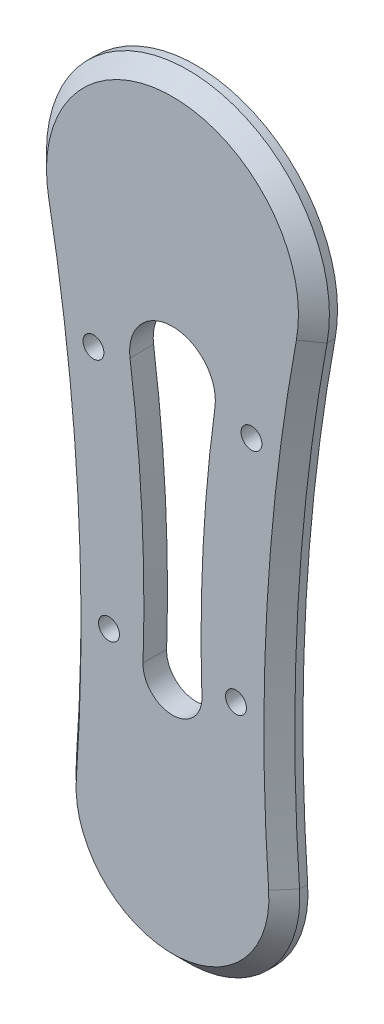
ISO-10303-21;
HEADER;
FILE_DESCRIPTION(('STEP AP214'),'2;1');
FILE_NAME('part.step','',(''),(''),'','','');
FILE_SCHEMA(('AUTOMOTIVE_DESIGN { 1 0 10303 214 1 1 1 1 }'));
ENDSEC;
DATA;
#1=APPLICATION_CONTEXT('core data for automotive mechanical design processes');
#2=APPLICATION_PROTOCOL_DEFINITION('international standard','automotive_design',2000,#1);
#3=PRODUCT_CONTEXT('',#1,'mechanical');
#4=PRODUCT('Part','Part','',(#3));
#5=PRODUCT_RELATED_PRODUCT_CATEGORY('part','',(#4));
#6=PRODUCT_DEFINITION_FORMATION('','',#4);
#7=PRODUCT_DEFINITION_CONTEXT('part definition',#1,'design');
#8=PRODUCT_DEFINITION('design','',#6,#7);
#9=PRODUCT_DEFINITION_SHAPE('','',#8);
#10=(LENGTH_UNIT() NAMED_UNIT(*) SI_UNIT(.MILLI.,.METRE.));
#11=(NAMED_UNIT(*) PLANE_ANGLE_UNIT() SI_UNIT($,.RADIAN.));
#12=(NAMED_UNIT(*) SI_UNIT($,.STERADIAN.) SOLID_ANGLE_UNIT());
#13=UNCERTAINTY_MEASURE_WITH_UNIT(LENGTH_MEASURE(1.E-05),#10,'distance_accuracy_value','');
#14=(GEOMETRIC_REPRESENTATION_CONTEXT(3) GLOBAL_UNCERTAINTY_ASSIGNED_CONTEXT((#13)) GLOBAL_UNIT_ASSIGNED_CONTEXT((#10,
#11,#12)) REPRESENTATION_CONTEXT('',''));
#15=CARTESIAN_POINT('',(0.,0.,0.));
#16=DIRECTION('',(0.,0.,1.));
#17=DIRECTION('',(1.,0.,0.));
#18=AXIS2_PLACEMENT_3D('',#15,#16,#17);
#19=CARTESIAN_POINT('',(-19.4999999999996,1.55431223447522E-12,19.5726638669023));
#20=DIRECTION('',(0.,0.,-1.));
#21=DIRECTION('',(-1.,0.,0.));
#22=AXIS2_PLACEMENT_3D('',#19,#20,#21);
#23=CYLINDRICAL_SURFACE('',#22,2.7);
#24=CARTESIAN_POINT('',(-19.4999999999996,1.55431223447522E-12,7.57266386690226));
#25=DIRECTION('',(0.,0.,1.));
#26=DIRECTION('',(1.,0.,0.));
#27=AXIS2_PLACEMENT_3D('',#24,#25,#26);
#28=CIRCLE('',#27,2.7);
#29=CARTESIAN_POINT('',(-16.7999999999996,1.55431223447522E-12,7.57266386690226));
#30=VERTEX_POINT('',#29);
#31=EDGE_CURVE('E178',#30,#30,#28,.T.);
#32=ORIENTED_EDGE('',*,*,#31,.T.);
#33=EDGE_LOOP('',(#32));
#34=FACE_BOUND('',#33,.T.);
#35=CARTESIAN_POINT('',(-19.4999999999996,1.55431223447522E-12,13.5726638669023));
#36=DIRECTION('',(0.,0.,1.));
#37=DIRECTION('',(1.,0.,0.));
#38=AXIS2_PLACEMENT_3D('',#35,#36,#37);
#39=CIRCLE('',#38,2.7);
#40=CARTESIAN_POINT('',(-16.7999999999996,1.55431223447522E-12,13.5726638669023));
#41=VERTEX_POINT('',#40);
#42=EDGE_CURVE('E181',#41,#41,#39,.T.);
#43=ORIENTED_EDGE('',*,*,#42,.F.);
#44=EDGE_LOOP('',(#43));
#45=FACE_BOUND('',#44,.T.);
#46=ADVANCED_FACE('F43',(#34,#45),#23,.T.);
#47=CARTESIAN_POINT('',(-19.4999999999996,1.55431223447522E-12,7.57266386690226));
#48=DIRECTION('',(0.,0.,1.));
#49=DIRECTION('',(1.,0.,0.));
#50=AXIS2_PLACEMENT_3D('',#47,#48,#49);
#51=PLANE('',#50);
#52=ORIENTED_EDGE('',*,*,#31,.F.);
#53=EDGE_LOOP('',(#52));
#54=FACE_BOUND('',#53,.T.);
#55=ADVANCED_FACE('F307',(#54),#51,.F.);
#56=CARTESIAN_POINT('',(-547.146552838921,-97.5401166047778,19.6726638669023));
#57=DIRECTION('',(0.,0.,-1.));
#58=DIRECTION('',(-1.,0.,0.));
#59=AXIS2_PLACEMENT_3D('',#56,#57,#58);
#60=CYLINDRICAL_SURFACE('',#59,500.000000000053);
#61=DIRECTION('',(0.,0.,-1.));
#62=VECTOR('',#61,1.);
#63=CARTESIAN_POINT('',(-48.3671014436859,-132.455140103575,19.6726638669023));
#64=LINE('',#63,#62);
#65=CARTESIAN_POINT('',(-48.3671014436859,-132.455140103575,15.6726638669024));
#66=VERTEX_POINT('',#65);
#67=CARTESIAN_POINT('',(-48.3671014436859,-132.455140103575,13.5726638669023));
#68=VERTEX_POINT('',#67);
#69=EDGE_CURVE('E176',#66,#68,#64,.T.);
#70=ORIENTED_EDGE('',*,*,#69,.F.);
#71=CARTESIAN_POINT('',(-547.146552838921,-97.5401166047778,15.6726638669024));
#72=DIRECTION('',(0.,0.,1.));
#73=DIRECTION('',(1.,0.,0.));
#74=AXIS2_PLACEMENT_3D('',#71,#72,#73);
#75=CIRCLE('',#74,500.000000000053);
#76=CARTESIAN_POINT('',(-55.4768441344805,-6.65063678151177,15.6726638669024));
#77=VERTEX_POINT('',#76);
#78=EDGE_CURVE('E52',#66,#77,#75,.T.);
#79=ORIENTED_EDGE('',*,*,#78,.T.);
#80=DIRECTION('',(0.,0.,-1.));
#81=VECTOR('',#80,1.);
#82=CARTESIAN_POINT('',(-55.4768441344805,-6.65063678151177,19.6726638669023));
#83=LINE('',#82,#81);
#84=CARTESIAN_POINT('',(-55.4768441344805,-6.65063678151177,13.5726638669023));
#85=VERTEX_POINT('',#84);
#86=EDGE_CURVE('E170',#77,#85,#83,.T.);
#87=ORIENTED_EDGE('',*,*,#86,.T.);
#88=CARTESIAN_POINT('',(-547.146552838921,-97.5401166047778,13.5726638669023));
#89=DIRECTION('',(0.,0.,-1.));
#90=DIRECTION('',(1.,0.,0.));
#91=AXIS2_PLACEMENT_3D('',#88,#89,#90);
#92=CIRCLE('',#91,500.000000000053);
#93=EDGE_CURVE('E157',#85,#68,#92,.T.);
#94=ORIENTED_EDGE('',*,*,#93,.T.);
#95=EDGE_LOOP('',(#70,#79,#87,#94));
#96=FACE_BOUND('',#95,.T.);
#97=ADVANCED_FACE('F285',(#96),#60,.F.);
#98=CARTESIAN_POINT('',(-19.5000000066264,-134.47586393692,19.6726638669023));
#99=DIRECTION('',(0.,0.,-1.));
#100=DIRECTION('',(-1.,0.,0.));
#101=AXIS2_PLACEMENT_3D('',#98,#99,#100);
#102=CYLINDRICAL_SURFACE('',#101,28.9377412765428);
#103=DIRECTION('',(0.,0.,-1.));
#104=VECTOR('',#103,1.);
#105=CARTESIAN_POINT('',(9.36710143043312,-132.455140103575,19.6726638669023));
#106=LINE('',#105,#104);
#107=CARTESIAN_POINT('',(9.36710143043312,-132.455140103575,15.6726638669024));
#108=VERTEX_POINT('',#107);
#109=CARTESIAN_POINT('',(9.36710143043312,-132.455140103575,13.5726638669023));
#110=VERTEX_POINT('',#109);
#111=EDGE_CURVE('E174',#108,#110,#106,.T.);
#112=ORIENTED_EDGE('',*,*,#111,.F.);
#113=CARTESIAN_POINT('',(-19.5000000066264,-134.47586393692,15.6726638669024));
#114=DIRECTION('',(0.,0.,1.));
#115=DIRECTION('',(1.,0.,0.));
#116=AXIS2_PLACEMENT_3D('',#113,#114,#115);
#117=CIRCLE('',#116,28.9377412765428);
#118=EDGE_CURVE('E198',#108,#66,#117,.F.);
#119=ORIENTED_EDGE('',*,*,#118,.T.);
#120=ORIENTED_EDGE('',*,*,#69,.T.);
#121=CARTESIAN_POINT('',(-19.5000000066264,-134.47586393692,13.5726638669023));
#122=DIRECTION('',(0.,0.,1.));
#123=DIRECTION('',(1.,0.,0.));
#124=AXIS2_PLACEMENT_3D('',#121,#122,#123);
#125=CIRCLE('',#124,28.9377412765428);
#126=EDGE_CURVE('E160',#68,#110,#125,.T.);
#127=ORIENTED_EDGE('',*,*,#126,.T.);
#128=EDGE_LOOP('',(#112,#119,#120,#127));
#129=FACE_BOUND('',#128,.T.);
#130=ADVANCED_FACE('F295',(#129),#102,.T.);
#131=CARTESIAN_POINT('',(508.146552829308,-97.5401166567808,19.6726638669023));
#132=DIRECTION('',(0.,0.,-1.));
#133=DIRECTION('',(-1.,0.,0.));
#134=AXIS2_PLACEMENT_3D('',#131,#132,#133);
#135=CYLINDRICAL_SURFACE('',#134,500.000000000053);
#136=DIRECTION('',(0.,0.,-1.));
#137=VECTOR('',#136,1.);
#138=CARTESIAN_POINT('',(16.4768441340433,-6.6506367838809,19.6726638669023));
#139=LINE('',#138,#137);
#140=CARTESIAN_POINT('',(16.4768441340433,-6.6506367838809,15.6726638669024));
#141=VERTEX_POINT('',#140);
#142=CARTESIAN_POINT('',(16.4768441340433,-6.6506367838809,13.5726638669023));
#143=VERTEX_POINT('',#142);
#144=EDGE_CURVE('E172',#141,#143,#139,.T.);
#145=ORIENTED_EDGE('',*,*,#144,.F.);
#146=CARTESIAN_POINT('',(508.146552829308,-97.5401166567808,15.6726638669024));
#147=DIRECTION('',(0.,0.,1.));
#148=DIRECTION('',(1.,0.,0.));
#149=AXIS2_PLACEMENT_3D('',#146,#147,#148);
#150=CIRCLE('',#149,500.000000000053);
#151=EDGE_CURVE('E193',#141,#108,#150,.T.);
#152=ORIENTED_EDGE('',*,*,#151,.T.);
#153=ORIENTED_EDGE('',*,*,#111,.T.);
#154=CARTESIAN_POINT('',(508.146552829308,-97.5401166567808,13.5726638669023));
#155=DIRECTION('',(0.,0.,-1.));
#156=DIRECTION('',(-1.,0.,0.));
#157=AXIS2_PLACEMENT_3D('',#154,#155,#156);
#158=CIRCLE('',#157,500.000000000053);
#159=EDGE_CURVE('E164',#110,#143,#158,.T.);
#160=ORIENTED_EDGE('',*,*,#159,.T.);
#161=EDGE_LOOP('',(#145,#152,#153,#160));
#162=FACE_BOUND('',#161,.T.);
#163=ADVANCED_FACE('F297',(#162),#135,.F.);
#164=CARTESIAN_POINT('',(-19.4999999999996,1.55431223447522E-12,19.6726638669023));
#165=DIRECTION('',(0.,0.,-1.));
#166=DIRECTION('',(-1.,0.,0.));
#167=AXIS2_PLACEMENT_3D('',#164,#165,#166);
#168=CYLINDRICAL_SURFACE('',#167,36.5863947865371);
#169=ORIENTED_EDGE('',*,*,#86,.F.);
#170=CARTESIAN_POINT('',(-19.4999999999996,1.55431223447522E-12,15.6726638669024));
#171=DIRECTION('',(0.,0.,1.));
#172=DIRECTION('',(1.,0.,0.));
#173=AXIS2_PLACEMENT_3D('',#170,#171,#172);
#174=CIRCLE('',#173,36.5863947865371);
#175=EDGE_CURVE('E196',#77,#141,#174,.F.);
#176=ORIENTED_EDGE('',*,*,#175,.T.);
#177=ORIENTED_EDGE('',*,*,#144,.T.);
#178=CARTESIAN_POINT('',(-19.4999999999996,1.55431223447522E-12,13.5726638669023));
#179=DIRECTION('',(0.,0.,1.));
#180=DIRECTION('',(1.,0.,0.));
#181=AXIS2_PLACEMENT_3D('',#178,#179,#180);
#182=CIRCLE('',#181,36.5863947865371);
#183=EDGE_CURVE('E167',#143,#85,#182,.T.);
#184=ORIENTED_EDGE('',*,*,#183,.T.);
#185=EDGE_LOOP('',(#169,#176,#177,#184));
#186=FACE_BOUND('',#185,.T.);
#187=ADVANCED_FACE('F252',(#186),#168,.T.);
#188=CARTESIAN_POINT('',(-283.32327641946,-48.7700583023881,19.6726638669023));
#189=DIRECTION('',(0.,0.,1.));
#190=DIRECTION('',(1.,0.,0.));
#191=AXIS2_PLACEMENT_3D('',#188,#189,#190);
#192=PLANE('',#191);
#193=CARTESIAN_POINT('',(-35.9207607316881,-94.8134263184718,19.6726638669023));
#194=DIRECTION('',(0.,0.,1.));
#195=DIRECTION('',(1.,0.,0.));
#196=AXIS2_PLACEMENT_3D('',#193,#194,#195);
#197=CIRCLE('',#196,2.69999999999612);
#198=CARTESIAN_POINT('',(-33.220760731692,-94.8134263184718,19.6726638669023));
#199=VERTEX_POINT('',#198);
#200=EDGE_CURVE('E242',#199,#199,#197,.T.);
#201=ORIENTED_EDGE('',*,*,#200,.F.);
#202=EDGE_LOOP('',(#201));
#203=FACE_BOUND('',#202,.T.);
#204=CARTESIAN_POINT('',(0.934899890596599,-33.6777132543675,19.6726638669023));
#205=DIRECTION('',(0.,0.,1.));
#206=DIRECTION('',(1.,0.,0.));
#207=AXIS2_PLACEMENT_3D('',#204,#205,#206);
#208=CIRCLE('',#207,2.69999999999766);
#209=CARTESIAN_POINT('',(3.63489989059426,-33.6777132543675,19.6726638669023));
#210=VERTEX_POINT('',#209);
#211=EDGE_CURVE('E239',#210,#210,#208,.T.);
#212=ORIENTED_EDGE('',*,*,#211,.F.);
#213=EDGE_LOOP('',(#212));
#214=FACE_BOUND('',#213,.T.);
#215=CARTESIAN_POINT('',(-3.07923927126588,-94.8134263184718,19.6726638669023));
#216=DIRECTION('',(0.,0.,1.));
#217=DIRECTION('',(1.,0.,0.));
#218=AXIS2_PLACEMENT_3D('',#215,#216,#217);
#219=CIRCLE('',#218,2.69999999999613);
#220=CARTESIAN_POINT('',(-0.379239271269753,-94.8134263184718,19.6726638669023));
#221=VERTEX_POINT('',#220);
#222=EDGE_CURVE('E236',#221,#221,#219,.T.);
#223=ORIENTED_EDGE('',*,*,#222,.F.);
#224=EDGE_LOOP('',(#223));
#225=FACE_BOUND('',#224,.T.);
#226=CARTESIAN_POINT('',(-39.9348998935506,-33.6777132543675,19.6726638669023));
#227=DIRECTION('',(0.,0.,1.));
#228=DIRECTION('',(1.,0.,0.));
#229=AXIS2_PLACEMENT_3D('',#226,#227,#228);
#230=CIRCLE('',#229,2.69999999999765);
#231=CARTESIAN_POINT('',(-37.2348998935529,-33.6777132543675,19.6726638669023));
#232=VERTEX_POINT('',#231);
#233=EDGE_CURVE('E233',#232,#232,#230,.T.);
#234=ORIENTED_EDGE('',*,*,#233,.F.);
#235=EDGE_LOOP('',(#234));
#236=FACE_BOUND('',#235,.T.);
#237=CARTESIAN_POINT('',(-423.649899701817,-84.7918260942612,19.6726638669023));
#238=DIRECTION('',(0.,0.,1.));
#239=DIRECTION('',(1.,0.,0.));
#240=AXIS2_PLACEMENT_3D('',#237,#238,#239);
#241=CIRCLE('',#240,396.762332756729);
#242=CARTESIAN_POINT('',(-30.4877253745416,-31.4640343453988,19.6726638669023));
#243=VERTEX_POINT('',#242);
#244=CARTESIAN_POINT('',(-27.1099861308731,-98.0751103157663,19.6726638669023));
#245=VERTEX_POINT('',#244);
#246=EDGE_CURVE('E154',#243,#245,#241,.F.);
#247=ORIENTED_EDGE('',*,*,#246,.F.);
#248=CARTESIAN_POINT('',(-19.500000001477,-29.9736795535344,19.6726638669023));
#249=DIRECTION('',(0.,0.,1.));
#250=DIRECTION('',(1.,0.,0.));
#251=AXIS2_PLACEMENT_3D('',#248,#249,#250);
#252=CIRCLE('',#251,11.0883392029429);
#253=CARTESIAN_POINT('',(-8.51227462841442,-31.464034345414,19.6726638669023));
#254=VERTEX_POINT('',#253);
#255=EDGE_CURVE('E147',#254,#243,#252,.T.);
#256=ORIENTED_EDGE('',*,*,#255,.F.);
#257=CARTESIAN_POINT('',(384.649899693461,-84.7918261340913,19.6726638669023));
#258=DIRECTION('',(0.,0.,1.));
#259=DIRECTION('',(1.,0.,0.));
#260=AXIS2_PLACEMENT_3D('',#257,#258,#259);
#261=CIRCLE('',#260,396.762332756729);
#262=CARTESIAN_POINT('',(-11.89001387881,-98.0751103159917,19.6726638669023));
#263=VERTEX_POINT('',#262);
#264=EDGE_CURVE('E127',#263,#254,#261,.F.);
#265=ORIENTED_EDGE('',*,*,#264,.F.);
#266=CARTESIAN_POINT('',(-19.5000000048453,-98.3300294428812,19.6726638669023));
#267=DIRECTION('',(0.,0.,1.));
#268=DIRECTION('',(1.,0.,0.));
#269=AXIS2_PLACEMENT_3D('',#266,#267,#268);
#270=CIRCLE('',#269,7.61425456625296);
#271=EDGE_CURVE('E152',#245,#263,#270,.T.);
#272=ORIENTED_EDGE('',*,*,#271,.F.);
#273=EDGE_LOOP('',(#247,#256,#265,#272));
#274=FACE_BOUND('',#273,.T.);
#275=CARTESIAN_POINT('',(-19.5000000066264,-134.47586393692,19.6726638669023));
#276=DIRECTION('',(0.,0.,1.));
#277=DIRECTION('',(1.,0.,0.));
#278=AXIS2_PLACEMENT_3D('',#275,#276,#277);
#279=CIRCLE('',#278,24.9377412765429);
#280=CARTESIAN_POINT('',(-44.3768658325245,-132.734460291565,19.6726638669023));
#281=VERTEX_POINT('',#280);
#282=CARTESIAN_POINT('',(5.37686581924259,-132.734460291149,19.6726638669023));
#283=VERTEX_POINT('',#282);
#284=EDGE_CURVE('E186',#281,#283,#279,.T.);
#285=ORIENTED_EDGE('',*,*,#284,.T.);
#286=CARTESIAN_POINT('',(508.146552829308,-97.5401166567808,19.6726638669023));
#287=DIRECTION('',(0.,0.,1.));
#288=DIRECTION('',(1.,0.,0.));
#289=AXIS2_PLACEMENT_3D('',#286,#287,#288);
#290=CIRCLE('',#289,504.000000000053);
#291=CARTESIAN_POINT('',(12.5434864644817,-5.9235209448978,19.6726638669023));
#292=VERTEX_POINT('',#291);
#293=EDGE_CURVE('E190',#283,#292,#290,.F.);
#294=ORIENTED_EDGE('',*,*,#293,.T.);
#295=CARTESIAN_POINT('',(-19.4999999999996,1.55431223447522E-12,19.6726638669023));
#296=DIRECTION('',(0.,0.,1.));
#297=DIRECTION('',(1.,0.,0.));
#298=AXIS2_PLACEMENT_3D('',#295,#296,#297);
#299=CIRCLE('',#298,32.5863947865372);
#300=CARTESIAN_POINT('',(-51.5434864648456,-5.92352094292575,19.6726638669023));
#301=VERTEX_POINT('',#300);
#302=EDGE_CURVE('E188',#292,#301,#299,.T.);
#303=ORIENTED_EDGE('',*,*,#302,.T.);
#304=CARTESIAN_POINT('',(-547.146552838921,-97.5401166047778,19.6726638669023));
#305=DIRECTION('',(0.,0.,1.));
#306=DIRECTION('',(1.,0.,0.));
#307=AXIS2_PLACEMENT_3D('',#304,#305,#306);
#308=CIRCLE('',#307,504.000000000053);
#309=EDGE_CURVE('E184',#301,#281,#308,.F.);
#310=ORIENTED_EDGE('',*,*,#309,.T.);
#311=EDGE_LOOP('',(#285,#294,#303,#310));
#312=FACE_BOUND('',#311,.T.);
#313=ADVANCED_FACE('F249',(#203,#214,#225,#236,#274,#312),#192,.T.);
#314=CARTESIAN_POINT('',(-283.32327641946,-48.7700583023881,13.5726638669023));
#315=DIRECTION('',(0.,0.,1.));
#316=DIRECTION('',(1.,0.,0.));
#317=AXIS2_PLACEMENT_3D('',#314,#315,#316);
#318=PLANE('',#317);
#319=CARTESIAN_POINT('',(-19.5000000066264,-134.47586393692,13.5726638669023));
#320=DIRECTION('',(0.,0.,1.));
#321=DIRECTION('',(1.,0.,0.));
#322=AXIS2_PLACEMENT_3D('',#319,#320,#321);
#323=CIRCLE('',#322,6.25);
#324=CARTESIAN_POINT('',(-13.2500000066264,-134.47586393692,13.5726638669023));
#325=VERTEX_POINT('',#324);
#326=EDGE_CURVE('E11',#325,#325,#323,.F.);
#327=ORIENTED_EDGE('',*,*,#326,.F.);
#328=EDGE_LOOP('',(#327));
#329=FACE_BOUND('',#328,.T.);
#330=CARTESIAN_POINT('',(-35.9207607316881,-94.8134263184718,13.5726638669023));
#331=DIRECTION('',(0.,0.,-1.));
#332=DIRECTION('',(-1.,0.,0.));
#333=AXIS2_PLACEMENT_3D('',#330,#331,#332);
#334=CIRCLE('',#333,2.69999999999612);
#335=CARTESIAN_POINT('',(-38.6207607316842,-94.8134263184718,13.5726638669023));
#336=VERTEX_POINT('',#335);
#337=EDGE_CURVE('E225',#336,#336,#334,.T.);
#338=ORIENTED_EDGE('',*,*,#337,.F.);
#339=EDGE_LOOP('',(#338));
#340=FACE_BOUND('',#339,.T.);
#341=CARTESIAN_POINT('',(0.934899890596599,-33.6777132543675,13.5726638669023));
#342=DIRECTION('',(0.,0.,-1.));
#343=DIRECTION('',(-1.,0.,0.));
#344=AXIS2_PLACEMENT_3D('',#341,#342,#343);
#345=CIRCLE('',#344,2.69999999999766);
#346=CARTESIAN_POINT('',(-1.76510010940106,-33.6777132543675,13.5726638669023));
#347=VERTEX_POINT('',#346);
#348=EDGE_CURVE('E215',#347,#347,#345,.T.);
#349=ORIENTED_EDGE('',*,*,#348,.F.);
#350=EDGE_LOOP('',(#349));
#351=FACE_BOUND('',#350,.T.);
#352=CARTESIAN_POINT('',(-3.07923927126588,-94.8134263184718,13.5726638669023));
#353=DIRECTION('',(0.,0.,-1.));
#354=DIRECTION('',(-1.,0.,0.));
#355=AXIS2_PLACEMENT_3D('',#352,#353,#354);
#356=CIRCLE('',#355,2.69999999999613);
#357=CARTESIAN_POINT('',(-5.779239271262,-94.8134263184718,13.5726638669023));
#358=VERTEX_POINT('',#357);
#359=EDGE_CURVE('E210',#358,#358,#356,.T.);
#360=ORIENTED_EDGE('',*,*,#359,.F.);
#361=EDGE_LOOP('',(#360));
#362=FACE_BOUND('',#361,.T.);
#363=CARTESIAN_POINT('',(-39.9348998935506,-33.6777132543675,13.5726638669023));
#364=DIRECTION('',(0.,0.,-1.));
#365=DIRECTION('',(-1.,0.,0.));
#366=AXIS2_PLACEMENT_3D('',#363,#364,#365);
#367=CIRCLE('',#366,2.69999999999765);
#368=CARTESIAN_POINT('',(-42.6348998935482,-33.6777132543675,13.5726638669023));
#369=VERTEX_POINT('',#368);
#370=EDGE_CURVE('E228',#369,#369,#367,.T.);
#371=ORIENTED_EDGE('',*,*,#370,.F.);
#372=EDGE_LOOP('',(#371));
#373=FACE_BOUND('',#372,.T.);
#374=CARTESIAN_POINT('',(-19.500000001477,-29.9736795535344,13.5726638669023));
#375=DIRECTION('',(0.,0.,-1.));
#376=DIRECTION('',(-1.,0.,0.));
#377=AXIS2_PLACEMENT_3D('',#374,#375,#376);
#378=CIRCLE('',#377,11.0883392029429);
#379=CARTESIAN_POINT('',(-30.4877253745416,-31.4640343453988,13.5726638669023));
#380=VERTEX_POINT('',#379);
#381=CARTESIAN_POINT('',(-8.51227462841447,-31.464034345414,13.5726638669023));
#382=VERTEX_POINT('',#381);
#383=EDGE_CURVE('E133',#380,#382,#378,.T.);
#384=ORIENTED_EDGE('',*,*,#383,.F.);
#385=CARTESIAN_POINT('',(-423.649899701817,-84.7918260942612,13.5726638669023));
#386=DIRECTION('',(0.,0.,1.));
#387=DIRECTION('',(-1.,0.,0.));
#388=AXIS2_PLACEMENT_3D('',#385,#386,#387);
#389=CIRCLE('',#388,396.762332756729);
#390=CARTESIAN_POINT('',(-27.1099861308731,-98.0751103157663,13.5726638669023));
#391=VERTEX_POINT('',#390);
#392=EDGE_CURVE('E67',#391,#380,#389,.T.);
#393=ORIENTED_EDGE('',*,*,#392,.F.);
#394=CARTESIAN_POINT('',(-19.5000000048453,-98.3300294428812,13.5726638669023));
#395=DIRECTION('',(0.,0.,-1.));
#396=DIRECTION('',(-1.,0.,0.));
#397=AXIS2_PLACEMENT_3D('',#394,#395,#396);
#398=CIRCLE('',#397,7.61425456625296);
#399=CARTESIAN_POINT('',(-11.89001387881,-98.0751103159917,13.5726638669023));
#400=VERTEX_POINT('',#399);
#401=EDGE_CURVE('E140',#400,#391,#398,.T.);
#402=ORIENTED_EDGE('',*,*,#401,.F.);
#403=CARTESIAN_POINT('',(384.649899693461,-84.7918261340913,13.5726638669023));
#404=DIRECTION('',(0.,0.,1.));
#405=DIRECTION('',(1.,0.,0.));
#406=AXIS2_PLACEMENT_3D('',#403,#404,#405);
#407=CIRCLE('',#406,396.762332756729);
#408=EDGE_CURVE('E124',#382,#400,#407,.T.);
#409=ORIENTED_EDGE('',*,*,#408,.F.);
#410=EDGE_LOOP('',(#384,#393,#402,#409));
#411=FACE_BOUND('',#410,.T.);
#412=ORIENTED_EDGE('',*,*,#42,.T.);
#413=EDGE_LOOP('',(#412));
#414=FACE_BOUND('',#413,.T.);
#415=ORIENTED_EDGE('',*,*,#93,.F.);
#416=ORIENTED_EDGE('',*,*,#183,.F.);
#417=ORIENTED_EDGE('',*,*,#159,.F.);
#418=ORIENTED_EDGE('',*,*,#126,.F.);
#419=EDGE_LOOP('',(#415,#416,#417,#418));
#420=FACE_BOUND('',#419,.T.);
#421=ADVANCED_FACE('F137',(#329,#340,#351,#362,#373,#411,#414,#420),#318,.F.);
#422=CARTESIAN_POINT('',(-547.146552838921,-97.5401166047778,19.6726638669023));
#423=DIRECTION('',(0.,0.,1.));
#424=DIRECTION('',(1.,0.,0.));
#425=AXIS2_PLACEMENT_3D('',#422,#423,#424);
#426=CONICAL_SURFACE('',#425,504.000000000053,0.785398163397448);
#427=DIRECTION('',(0.695325970257767,0.128537135043084,0.707106781186555));
#428=VECTOR('',#427,1.);
#429=CARTESIAN_POINT('',(-55.4768441344805,-6.65063678151177,15.6726638669024));
#430=LINE('',#429,#428);
#431=EDGE_CURVE('E204',#77,#301,#430,.T.);
#432=ORIENTED_EDGE('',*,*,#431,.F.);
#433=ORIENTED_EDGE('',*,*,#78,.F.);
#434=DIRECTION('',(-0.705380664796081,0.0493772997625697,-0.707106781186545));
#435=VECTOR('',#434,1.);
#436=CARTESIAN_POINT('',(-44.3768658325245,-132.734460291565,19.6726638669023));
#437=LINE('',#436,#435);
#438=EDGE_CURVE('E161',#281,#66,#437,.T.);
#439=ORIENTED_EDGE('',*,*,#438,.F.);
#440=ORIENTED_EDGE('',*,*,#309,.F.);
#441=EDGE_LOOP('',(#432,#433,#439,#440));
#442=FACE_BOUND('',#441,.T.);
#443=ADVANCED_FACE('F46',(#442),#426,.F.);
#444=CARTESIAN_POINT('',(-19.5000000066264,-134.47586393692,19.6726638669023));
#445=DIRECTION('',(0.,0.,-1.));
#446=DIRECTION('',(-1.,0.,0.));
#447=AXIS2_PLACEMENT_3D('',#444,#445,#446);
#448=CONICAL_SURFACE('',#447,24.9377412765429,0.785398163397452);
#449=ORIENTED_EDGE('',*,*,#438,.T.);
#450=ORIENTED_EDGE('',*,*,#118,.F.);
#451=DIRECTION('',(0.705380664801229,0.0493772996890256,-0.707106781186545));
#452=VECTOR('',#451,1.);
#453=CARTESIAN_POINT('',(5.37686581924259,-132.734460291149,19.6726638669023));
#454=LINE('',#453,#452);
#455=EDGE_CURVE('E202',#283,#108,#454,.T.);
#456=ORIENTED_EDGE('',*,*,#455,.F.);
#457=ORIENTED_EDGE('',*,*,#284,.F.);
#458=EDGE_LOOP('',(#449,#450,#456,#457));
#459=FACE_BOUND('',#458,.T.);
#460=ADVANCED_FACE('F270',(#459),#448,.T.);
#461=CARTESIAN_POINT('',(-19.4999999999996,1.55431223447522E-12,19.6726638669023));
#462=DIRECTION('',(0.,0.,-1.));
#463=DIRECTION('',(-1.,0.,0.));
#464=AXIS2_PLACEMENT_3D('',#461,#462,#463);
#465=CONICAL_SURFACE('',#464,32.5863947865372,0.785398163397452);
#466=ORIENTED_EDGE('',*,*,#431,.T.);
#467=ORIENTED_EDGE('',*,*,#302,.F.);
#468=DIRECTION('',(-0.695325970244801,0.128537135113278,0.707106781186545));
#469=VECTOR('',#468,1.);
#470=CARTESIAN_POINT('',(16.4768441340433,-6.6506367838809,15.6726638669024));
#471=LINE('',#470,#469);
#472=EDGE_CURVE('E156',#141,#292,#471,.T.);
#473=ORIENTED_EDGE('',*,*,#472,.F.);
#474=ORIENTED_EDGE('',*,*,#175,.F.);
#475=EDGE_LOOP('',(#466,#467,#473,#474));
#476=FACE_BOUND('',#475,.T.);
#477=ADVANCED_FACE('F278',(#476),#465,.T.);
#478=CARTESIAN_POINT('',(508.146552829308,-97.5401166567808,19.6726638669023));
#479=DIRECTION('',(0.,0.,1.));
#480=DIRECTION('',(1.,0.,0.));
#481=AXIS2_PLACEMENT_3D('',#478,#479,#480);
#482=CONICAL_SURFACE('',#481,504.000000000053,0.785398163397448);
#483=ORIENTED_EDGE('',*,*,#455,.T.);
#484=ORIENTED_EDGE('',*,*,#151,.F.);
#485=ORIENTED_EDGE('',*,*,#472,.T.);
#486=ORIENTED_EDGE('',*,*,#293,.F.);
#487=EDGE_LOOP('',(#483,#484,#485,#486));
#488=FACE_BOUND('',#487,.T.);
#489=ADVANCED_FACE('F273',(#488),#482,.F.);
#490=CARTESIAN_POINT('',(-423.649899701817,-84.7918260942612,36.5726638669023));
#491=DIRECTION('',(0.,0.,-1.));
#492=DIRECTION('',(-1.,0.,0.));
#493=AXIS2_PLACEMENT_3D('',#490,#491,#492);
#494=CYLINDRICAL_SURFACE('',#493,396.762332756729);
#495=ORIENTED_EDGE('',*,*,#246,.T.);
#496=DIRECTION('',(0.,0.,-1.));
#497=VECTOR('',#496,1.);
#498=CARTESIAN_POINT('',(-27.1099861308731,-98.0751103157663,36.5726638669023));
#499=LINE('',#498,#497);
#500=EDGE_CURVE('E145',#245,#391,#499,.T.);
#501=ORIENTED_EDGE('',*,*,#500,.T.);
#502=ORIENTED_EDGE('',*,*,#392,.T.);
#503=DIRECTION('',(0.,0.,-1.));
#504=VECTOR('',#503,1.);
#505=CARTESIAN_POINT('',(-30.4877253745416,-31.4640343453988,36.5726638669023));
#506=LINE('',#505,#504);
#507=EDGE_CURVE('E130',#243,#380,#506,.T.);
#508=ORIENTED_EDGE('',*,*,#507,.F.);
#509=EDGE_LOOP('',(#495,#501,#502,#508));
#510=FACE_BOUND('',#509,.T.);
#511=ADVANCED_FACE('F324',(#510),#494,.T.);
#512=CARTESIAN_POINT('',(-19.5000000048453,-98.3300294428812,36.5726638669023));
#513=DIRECTION('',(0.,0.,-1.));
#514=DIRECTION('',(-1.,0.,0.));
#515=AXIS2_PLACEMENT_3D('',#512,#513,#514);
#516=CYLINDRICAL_SURFACE('',#515,7.61425456625296);
#517=ORIENTED_EDGE('',*,*,#271,.T.);
#518=DIRECTION('',(0.,0.,-1.));
#519=VECTOR('',#518,1.);
#520=CARTESIAN_POINT('',(-11.89001387881,-98.0751103159917,36.5726638669023));
#521=LINE('',#520,#519);
#522=EDGE_CURVE('E129',#263,#400,#521,.T.);
#523=ORIENTED_EDGE('',*,*,#522,.T.);
#524=ORIENTED_EDGE('',*,*,#401,.T.);
#525=ORIENTED_EDGE('',*,*,#500,.F.);
#526=EDGE_LOOP('',(#517,#523,#524,#525));
#527=FACE_BOUND('',#526,.T.);
#528=ADVANCED_FACE('F354',(#527),#516,.F.);
#529=CARTESIAN_POINT('',(384.649899693461,-84.7918261340913,36.5726638669023));
#530=DIRECTION('',(0.,0.,-1.));
#531=DIRECTION('',(-1.,0.,0.));
#532=AXIS2_PLACEMENT_3D('',#529,#530,#531);
#533=CYLINDRICAL_SURFACE('',#532,396.762332756729);
#534=ORIENTED_EDGE('',*,*,#264,.T.);
#535=DIRECTION('',(0.,0.,-1.));
#536=VECTOR('',#535,1.);
#537=CARTESIAN_POINT('',(-8.51227462841447,-31.464034345414,36.5726638669023));
#538=LINE('',#537,#536);
#539=EDGE_CURVE('E59',#254,#382,#538,.T.);
#540=ORIENTED_EDGE('',*,*,#539,.T.);
#541=ORIENTED_EDGE('',*,*,#408,.T.);
#542=ORIENTED_EDGE('',*,*,#522,.F.);
#543=EDGE_LOOP('',(#534,#540,#541,#542));
#544=FACE_BOUND('',#543,.T.);
#545=ADVANCED_FACE('F121',(#544),#533,.T.);
#546=CARTESIAN_POINT('',(-19.500000001477,-29.9736795535344,36.5726638669023));
#547=DIRECTION('',(0.,0.,-1.));
#548=DIRECTION('',(-1.,0.,0.));
#549=AXIS2_PLACEMENT_3D('',#546,#547,#548);
#550=CYLINDRICAL_SURFACE('',#549,11.0883392029429);
#551=ORIENTED_EDGE('',*,*,#255,.T.);
#552=ORIENTED_EDGE('',*,*,#507,.T.);
#553=ORIENTED_EDGE('',*,*,#383,.T.);
#554=ORIENTED_EDGE('',*,*,#539,.F.);
#555=EDGE_LOOP('',(#551,#552,#553,#554));
#556=FACE_BOUND('',#555,.T.);
#557=ADVANCED_FACE('F134',(#556),#550,.F.);
#558=CARTESIAN_POINT('',(-39.9348998935506,-33.6777132543675,50.5726638669023));
#559=DIRECTION('',(0.,0.,-1.));
#560=DIRECTION('',(-1.,0.,0.));
#561=AXIS2_PLACEMENT_3D('',#558,#559,#560);
#562=CYLINDRICAL_SURFACE('',#561,2.69999999999765);
#563=ORIENTED_EDGE('',*,*,#233,.T.);
#564=EDGE_LOOP('',(#563));
#565=FACE_BOUND('',#564,.T.);
#566=ORIENTED_EDGE('',*,*,#370,.T.);
#567=EDGE_LOOP('',(#566));
#568=FACE_BOUND('',#567,.T.);
#569=ADVANCED_FACE('F357',(#565,#568),#562,.F.);
#570=CARTESIAN_POINT('',(-3.07923927126588,-94.8134263184718,50.5726638669023));
#571=DIRECTION('',(0.,0.,-1.));
#572=DIRECTION('',(-1.,0.,0.));
#573=AXIS2_PLACEMENT_3D('',#570,#571,#572);
#574=CYLINDRICAL_SURFACE('',#573,2.69999999999613);
#575=ORIENTED_EDGE('',*,*,#222,.T.);
#576=EDGE_LOOP('',(#575));
#577=FACE_BOUND('',#576,.T.);
#578=ORIENTED_EDGE('',*,*,#359,.T.);
#579=EDGE_LOOP('',(#578));
#580=FACE_BOUND('',#579,.T.);
#581=ADVANCED_FACE('F365',(#577,#580),#574,.F.);
#582=CARTESIAN_POINT('',(0.934899890596599,-33.6777132543675,50.5726638669023));
#583=DIRECTION('',(0.,0.,-1.));
#584=DIRECTION('',(-1.,0.,0.));
#585=AXIS2_PLACEMENT_3D('',#582,#583,#584);
#586=CYLINDRICAL_SURFACE('',#585,2.69999999999766);
#587=ORIENTED_EDGE('',*,*,#211,.T.);
#588=EDGE_LOOP('',(#587));
#589=FACE_BOUND('',#588,.T.);
#590=ORIENTED_EDGE('',*,*,#348,.T.);
#591=EDGE_LOOP('',(#590));
#592=FACE_BOUND('',#591,.T.);
#593=ADVANCED_FACE('F367',(#589,#592),#586,.F.);
#594=CARTESIAN_POINT('',(-35.9207607316881,-94.8134263184718,50.5726638669023));
#595=DIRECTION('',(0.,0.,-1.));
#596=DIRECTION('',(-1.,0.,0.));
#597=AXIS2_PLACEMENT_3D('',#594,#595,#596);
#598=CYLINDRICAL_SURFACE('',#597,2.69999999999612);
#599=ORIENTED_EDGE('',*,*,#200,.T.);
#600=EDGE_LOOP('',(#599));
#601=FACE_BOUND('',#600,.T.);
#602=ORIENTED_EDGE('',*,*,#337,.T.);
#603=EDGE_LOOP('',(#602));
#604=FACE_BOUND('',#603,.T.);
#605=ADVANCED_FACE('F246',(#601,#604),#598,.F.);
#606=CARTESIAN_POINT('',(-19.5000000066264,-134.47586393692,11.0726638669023));
#607=DIRECTION('',(0.,0.,1.));
#608=DIRECTION('',(1.,0.,0.));
#609=AXIS2_PLACEMENT_3D('',#606,#607,#608);
#610=CYLINDRICAL_SURFACE('',#609,6.25);
#611=CARTESIAN_POINT('',(-19.5000000066264,-134.47586393692,11.0726638669023));
#612=DIRECTION('',(0.,0.,-1.));
#613=DIRECTION('',(-1.,0.,0.));
#614=AXIS2_PLACEMENT_3D('',#611,#612,#613);
#615=CIRCLE('',#614,6.25);
#616=CARTESIAN_POINT('',(-25.7500000066264,-134.47586393692,11.0726638669023));
#617=VERTEX_POINT('',#616);
#618=EDGE_CURVE('E211',#617,#617,#615,.T.);
#619=ORIENTED_EDGE('',*,*,#618,.F.);
#620=EDGE_LOOP('',(#619));
#621=FACE_BOUND('',#620,.T.);
#622=ORIENTED_EDGE('',*,*,#326,.T.);
#623=EDGE_LOOP('',(#622));
#624=FACE_BOUND('',#623,.T.);
#625=ADVANCED_FACE('F373',(#621,#624),#610,.T.);
#626=CARTESIAN_POINT('',(-19.5000000066264,-134.47586393692,11.0726638669023));
#627=DIRECTION('',(0.,0.,-1.));
#628=DIRECTION('',(-1.,0.,0.));
#629=AXIS2_PLACEMENT_3D('',#626,#627,#628);
#630=PLANE('',#629);
#631=CARTESIAN_POINT('',(-19.5000000066264,-134.47586393692,11.0726638669023));
#632=DIRECTION('',(0.,0.,-1.));
#633=DIRECTION('',(-1.,0.,0.));
#634=AXIS2_PLACEMENT_3D('',#631,#632,#633);
#635=CIRCLE('',#634,2.7);
#636=CARTESIAN_POINT('',(-16.8000000066264,-134.47586393692,11.0726638669023));
#637=VERTEX_POINT('',#636);
#638=EDGE_CURVE('E208',#637,#637,#635,.T.);
#639=ORIENTED_EDGE('',*,*,#638,.F.);
#640=EDGE_LOOP('',(#639));
#641=FACE_BOUND('',#640,.T.);
#642=ORIENTED_EDGE('',*,*,#618,.T.);
#643=EDGE_LOOP('',(#642));
#644=FACE_BOUND('',#643,.T.);
#645=ADVANCED_FACE('F351',(#641,#644),#630,.T.);
#646=CARTESIAN_POINT('',(-19.5000000066264,-134.47586393692,-0.0640893699124737));
#647=DIRECTION('',(0.,0.,1.));
#648=DIRECTION('',(1.,0.,0.));
#649=AXIS2_PLACEMENT_3D('',#646,#647,#648);
#650=CYLINDRICAL_SURFACE('',#649,2.7);
#651=CARTESIAN_POINT('',(-19.5000000066264,-134.47586393692,3.07266386690226));
#652=DIRECTION('',(0.,0.,-1.));
#653=DIRECTION('',(-1.,0.,0.));
#654=AXIS2_PLACEMENT_3D('',#651,#652,#653);
#655=CIRCLE('',#654,2.70000000000001);
#656=CARTESIAN_POINT('',(-16.8000000066264,-134.47586393692,3.07266386690226));
#657=VERTEX_POINT('',#656);
#658=EDGE_CURVE('E218',#657,#657,#655,.T.);
#659=CARTESIAN_POINT('',(-16.8000000066264,-134.47586393692,11.0726638669023));
#660=CARTESIAN_POINT('',(-16.8000000066264,-134.47586393692,10.9893305335689));
#661=CARTESIAN_POINT('',(-16.8000000066264,-134.47586393692,10.9059972002356));
#662=CARTESIAN_POINT('',(-16.8000000066264,-134.47586393692,10.7393305335689));
#663=CARTESIAN_POINT('',(-16.8000000066264,-134.47586393692,10.6559972002356));
#664=CARTESIAN_POINT('',(-16.8000000066264,-134.47586393692,10.4893305335689));
#665=CARTESIAN_POINT('',(-16.8000000066264,-134.47586393692,10.4059972002356));
#666=CARTESIAN_POINT('',(-16.8000000066264,-134.47586393692,10.2393305335689));
#667=CARTESIAN_POINT('',(-16.8000000066264,-134.47586393692,10.1559972002356));
#668=CARTESIAN_POINT('',(-16.8000000066264,-134.47586393692,9.98933053356892));
#669=CARTESIAN_POINT('',(-16.8000000066264,-134.47586393692,9.90599720023559));
#670=CARTESIAN_POINT('',(-16.8000000066264,-134.47586393692,9.73933053356893));
#671=CARTESIAN_POINT('',(-16.8000000066264,-134.47586393692,9.65599720023559));
#672=CARTESIAN_POINT('',(-16.8000000066264,-134.47586393692,9.48933053356893));
#673=CARTESIAN_POINT('',(-16.8000000066264,-134.47586393692,9.40599720023559));
#674=CARTESIAN_POINT('',(-16.8000000066264,-134.47586393692,9.23933053356892));
#675=CARTESIAN_POINT('',(-16.8000000066264,-134.47586393692,9.15599720023559));
#676=CARTESIAN_POINT('',(-16.8000000066264,-134.47586393692,8.98933053356892));
#677=CARTESIAN_POINT('',(-16.8000000066264,-134.47586393692,8.90599720023559));
#678=CARTESIAN_POINT('',(-16.8000000066264,-134.47586393692,8.73933053356892));
#679=CARTESIAN_POINT('',(-16.8000000066264,-134.47586393692,8.65599720023559));
#680=CARTESIAN_POINT('',(-16.8000000066264,-134.47586393692,8.48933053356892));
#681=CARTESIAN_POINT('',(-16.8000000066264,-134.47586393692,8.40599720023559));
#682=CARTESIAN_POINT('',(-16.8000000066264,-134.47586393692,8.23933053356893));
#683=CARTESIAN_POINT('',(-16.8000000066264,-134.47586393692,8.15599720023559));
#684=CARTESIAN_POINT('',(-16.8000000066264,-134.47586393692,7.98933053356893));
#685=CARTESIAN_POINT('',(-16.8000000066264,-134.47586393692,7.90599720023559));
#686=CARTESIAN_POINT('',(-16.8000000066264,-134.47586393692,7.73933053356893));
#687=CARTESIAN_POINT('',(-16.8000000066264,-134.47586393692,7.65599720023559));
#688=CARTESIAN_POINT('',(-16.8000000066264,-134.47586393692,7.48933053356893));
#689=CARTESIAN_POINT('',(-16.8000000066264,-134.47586393692,7.40599720023559));
#690=CARTESIAN_POINT('',(-16.8000000066264,-134.47586393692,7.23933053356893));
#691=CARTESIAN_POINT('',(-16.8000000066264,-134.47586393692,7.15599720023559));
#692=CARTESIAN_POINT('',(-16.8000000066264,-134.47586393692,6.98933053356893));
#693=CARTESIAN_POINT('',(-16.8000000066264,-134.47586393692,6.90599720023559));
#694=CARTESIAN_POINT('',(-16.8000000066264,-134.47586393692,6.73933053356892));
#695=CARTESIAN_POINT('',(-16.8000000066264,-134.47586393692,6.65599720023559));
#696=CARTESIAN_POINT('',(-16.8000000066264,-134.47586393692,6.48933053356893));
#697=CARTESIAN_POINT('',(-16.8000000066264,-134.47586393692,6.40599720023559));
#698=CARTESIAN_POINT('',(-16.8000000066264,-134.47586393692,6.23933053356893));
#699=CARTESIAN_POINT('',(-16.8000000066264,-134.47586393692,6.15599720023559));
#700=CARTESIAN_POINT('',(-16.8000000066264,-134.47586393692,5.98933053356893));
#701=CARTESIAN_POINT('',(-16.8000000066264,-134.47586393692,5.90599720023559));
#702=CARTESIAN_POINT('',(-16.8000000066264,-134.47586393692,5.73933053356893));
#703=CARTESIAN_POINT('',(-16.8000000066264,-134.47586393692,5.65599720023559));
#704=CARTESIAN_POINT('',(-16.8000000066264,-134.47586393692,5.48933053356893));
#705=CARTESIAN_POINT('',(-16.8000000066264,-134.47586393692,5.40599720023559));
#706=CARTESIAN_POINT('',(-16.8000000066264,-134.47586393692,5.23933053356893));
#707=CARTESIAN_POINT('',(-16.8000000066264,-134.47586393692,5.15599720023559));
#708=CARTESIAN_POINT('',(-16.8000000066264,-134.47586393692,4.98933053356892));
#709=CARTESIAN_POINT('',(-16.8000000066264,-134.47586393692,4.90599720023559));
#710=CARTESIAN_POINT('',(-16.8000000066264,-134.47586393692,4.73933053356892));
#711=CARTESIAN_POINT('',(-16.8000000066264,-134.47586393692,4.65599720023559));
#712=CARTESIAN_POINT('',(-16.8000000066264,-134.47586393692,4.48933053356893));
#713=CARTESIAN_POINT('',(-16.8000000066264,-134.47586393692,4.40599720023559));
#714=CARTESIAN_POINT('',(-16.8000000066264,-134.47586393692,4.23933053356893));
#715=CARTESIAN_POINT('',(-16.8000000066264,-134.47586393692,4.15599720023559));
#716=CARTESIAN_POINT('',(-16.8000000066264,-134.47586393692,3.98933053356893));
#717=CARTESIAN_POINT('',(-16.8000000066264,-134.47586393692,3.90599720023559));
#718=CARTESIAN_POINT('',(-16.8000000066264,-134.47586393692,3.73933053356893));
#719=CARTESIAN_POINT('',(-16.8000000066264,-134.47586393692,3.65599720023559));
#720=CARTESIAN_POINT('',(-16.8000000066264,-134.47586393692,3.48933053356893));
#721=CARTESIAN_POINT('',(-16.8000000066264,-134.47586393692,3.40599720023559));
#722=CARTESIAN_POINT('',(-16.8000000066264,-134.47586393692,3.23933053356893));
#723=CARTESIAN_POINT('',(-16.8000000066264,-134.47586393692,3.15599720023559));
#724=CARTESIAN_POINT('',(-16.8000000066264,-134.47586393692,3.07266386690226));
#725=B_SPLINE_CURVE_WITH_KNOTS('',3,(#659,#660,#661,#662,#663,#664,#665,#666,#667,#668,#669,
#670,#671,#672,#673,#674,#675,#676,#677,#678,#679,#680,#681,#682,#683,#684,#685,#686,#687,#688,
#689,#690,#691,#692,#693,#694,#695,#696,#697,#698,#699,#700,#701,#702,#703,#704,#705,#706,#707,
#708,#709,#710,#711,#712,#713,#714,#715,#716,#717,#718,#719,#720,#721,#722,#723,#724),
.UNSPECIFIED.,.F.,.F.,(4,2,2,2,2,2,2,2,2,2,2,2,2,2,2,2,2,2,2,2,2,2,2,2,2,2,2,2,2,2,2,2,4),(0.,
0.25,0.5,0.750000000000001,1.,1.25,1.5,1.75,2.,2.25,2.5,2.75,3.,3.25,3.5,3.75,4.,4.25,4.5,4.75,
5.,5.25,5.5,5.75,6.,6.25,6.5,6.75,7.,7.25,7.5,7.75,8.),.UNSPECIFIED.);
#726=EDGE_CURVE('BSEAM347',#637,#657,#725,.T.);
#727=ORIENTED_EDGE('',*,*,#638,.T.);
#728=ORIENTED_EDGE('',*,*,#658,.F.);
#729=ORIENTED_EDGE('',*,*,#726,.T.);
#730=ORIENTED_EDGE('',*,*,#726,.F.);
#731=EDGE_LOOP('',(#727,#729,#728,#730));
#732=FACE_BOUND('',#731,.T.);
#733=ADVANCED_FACE('F347',(#732),#650,.T.);
#734=CARTESIAN_POINT('',(-19.5000000066264,-134.47586393692,3.07266386690226));
#735=DIRECTION('',(0.,0.,-1.));
#736=DIRECTION('',(-1.,0.,0.));
#737=AXIS2_PLACEMENT_3D('',#734,#735,#736);
#738=PLANE('',#737);
#739=ORIENTED_EDGE('',*,*,#658,.T.);
#740=EDGE_LOOP('',(#739));
#741=FACE_BOUND('',#740,.T.);
#742=ADVANCED_FACE('F350',(#741),#738,.T.);
#743=CLOSED_SHELL('',(#46,#55,#97,#130,#163,#187,#313,#421,#443,#460,#477,#489,#511,#528,#545,
#557,#569,#581,#593,#605,#625,#645,#733,#742));
#744=MANIFOLD_SOLID_BREP('B2',#743);
#745=ADVANCED_BREP_SHAPE_REPRESENTATION('',(#18,#744),#14);
#746=SHAPE_DEFINITION_REPRESENTATION(#9,#745);
ENDSEC;
END-ISO-10303-21;
